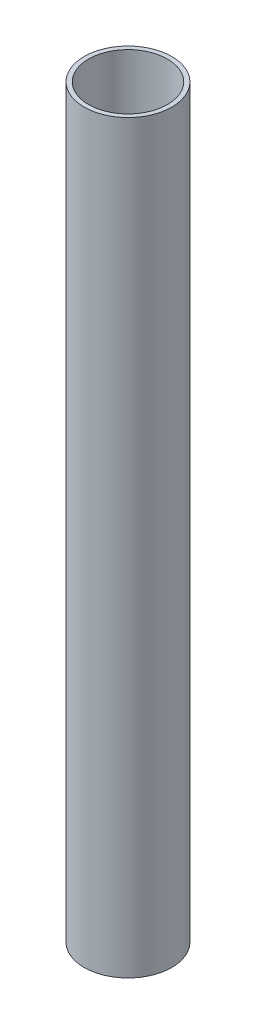
ISO-10303-21;
HEADER;
FILE_DESCRIPTION(('STEP AP214'),'2;1');
FILE_NAME('part.step','',(''),(''),'','','');
FILE_SCHEMA(('AUTOMOTIVE_DESIGN { 1 0 10303 214 1 1 1 1 }'));
ENDSEC;
DATA;
#1=APPLICATION_CONTEXT('core data for automotive mechanical design processes');
#2=APPLICATION_PROTOCOL_DEFINITION('international standard','automotive_design',2000,#1);
#3=PRODUCT_CONTEXT('',#1,'mechanical');
#4=PRODUCT('Part','Part','',(#3));
#5=PRODUCT_RELATED_PRODUCT_CATEGORY('part','',(#4));
#6=PRODUCT_DEFINITION_FORMATION('','',#4);
#7=PRODUCT_DEFINITION_CONTEXT('part definition',#1,'design');
#8=PRODUCT_DEFINITION('design','',#6,#7);
#9=PRODUCT_DEFINITION_SHAPE('','',#8);
#10=(LENGTH_UNIT() NAMED_UNIT(*) SI_UNIT(.MILLI.,.METRE.));
#11=(NAMED_UNIT(*) PLANE_ANGLE_UNIT() SI_UNIT($,.RADIAN.));
#12=(NAMED_UNIT(*) SI_UNIT($,.STERADIAN.) SOLID_ANGLE_UNIT());
#13=UNCERTAINTY_MEASURE_WITH_UNIT(LENGTH_MEASURE(1.E-05),#10,'distance_accuracy_value','');
#14=(GEOMETRIC_REPRESENTATION_CONTEXT(3) GLOBAL_UNCERTAINTY_ASSIGNED_CONTEXT((#13)) GLOBAL_UNIT_ASSIGNED_CONTEXT((#10,
#11,#12)) REPRESENTATION_CONTEXT('',''));
#15=CARTESIAN_POINT('',(0.,0.,0.));
#16=DIRECTION('',(0.,0.,1.));
#17=DIRECTION('',(1.,0.,0.));
#18=AXIS2_PLACEMENT_3D('',#15,#16,#17);
#19=CARTESIAN_POINT('',(0.,170.,0.));
#20=DIRECTION('',(0.,1.,0.));
#21=DIRECTION('',(0.,0.,1.));
#22=AXIS2_PLACEMENT_3D('',#19,#20,#21);
#23=PLANE('',#22);
#24=CARTESIAN_POINT('',(0.,170.,0.));
#25=DIRECTION('',(0.,1.,0.));
#26=DIRECTION('',(0.,0.,1.));
#27=AXIS2_PLACEMENT_3D('',#24,#25,#26);
#28=CIRCLE('',#27,10.);
#29=CARTESIAN_POINT('',(0.,170.,10.));
#30=VERTEX_POINT('',#29);
#31=EDGE_CURVE('E10',#30,#30,#28,.T.);
#32=ORIENTED_EDGE('',*,*,#31,.T.);
#33=EDGE_LOOP('',(#32));
#34=FACE_BOUND('',#33,.T.);
#35=CARTESIAN_POINT('',(0.,170.,0.));
#36=DIRECTION('',(0.,1.,0.));
#37=DIRECTION('',(0.,0.,1.));
#38=AXIS2_PLACEMENT_3D('',#35,#36,#37);
#39=CIRCLE('',#38,9.);
#40=CARTESIAN_POINT('',(0.,170.,9.));
#41=VERTEX_POINT('',#40);
#42=EDGE_CURVE('E50',#41,#41,#39,.T.);
#43=ORIENTED_EDGE('',*,*,#42,.F.);
#44=EDGE_LOOP('',(#43));
#45=FACE_BOUND('',#44,.T.);
#46=ADVANCED_FACE('F37',(#34,#45),#23,.T.);
#47=CARTESIAN_POINT('',(0.,0.,0.));
#48=DIRECTION('',(0.,1.,0.));
#49=DIRECTION('',(0.,0.,1.));
#50=AXIS2_PLACEMENT_3D('',#47,#48,#49);
#51=PLANE('',#50);
#52=CARTESIAN_POINT('',(0.,0.,0.));
#53=DIRECTION('',(0.,1.,0.));
#54=DIRECTION('',(0.,0.,1.));
#55=AXIS2_PLACEMENT_3D('',#52,#53,#54);
#56=CIRCLE('',#55,10.);
#57=CARTESIAN_POINT('',(0.,0.,10.));
#58=VERTEX_POINT('',#57);
#59=EDGE_CURVE('E41',#58,#58,#56,.T.);
#60=ORIENTED_EDGE('',*,*,#59,.F.);
#61=EDGE_LOOP('',(#60));
#62=FACE_BOUND('',#61,.T.);
#63=CARTESIAN_POINT('',(0.,0.,0.));
#64=DIRECTION('',(0.,1.,0.));
#65=DIRECTION('',(0.,0.,1.));
#66=AXIS2_PLACEMENT_3D('',#63,#64,#65);
#67=CIRCLE('',#66,9.);
#68=CARTESIAN_POINT('',(0.,0.,9.));
#69=VERTEX_POINT('',#68);
#70=EDGE_CURVE('E52',#69,#69,#67,.T.);
#71=ORIENTED_EDGE('',*,*,#70,.T.);
#72=EDGE_LOOP('',(#71));
#73=FACE_BOUND('',#72,.T.);
#74=ADVANCED_FACE('F64',(#62,#73),#51,.F.);
#75=CARTESIAN_POINT('',(0.,170.,0.));
#76=DIRECTION('',(0.,-1.,0.));
#77=DIRECTION('',(0.,0.,-1.));
#78=AXIS2_PLACEMENT_3D('',#75,#76,#77);
#79=CYLINDRICAL_SURFACE('',#78,10.);
#80=ORIENTED_EDGE('',*,*,#31,.F.);
#81=EDGE_LOOP('',(#80));
#82=FACE_BOUND('',#81,.T.);
#83=ORIENTED_EDGE('',*,*,#59,.T.);
#84=EDGE_LOOP('',(#83));
#85=FACE_BOUND('',#84,.T.);
#86=ADVANCED_FACE('F39',(#82,#85),#79,.T.);
#87=CARTESIAN_POINT('',(0.,170.,0.));
#88=DIRECTION('',(0.,-1.,0.));
#89=DIRECTION('',(0.,0.,-1.));
#90=AXIS2_PLACEMENT_3D('',#87,#88,#89);
#91=CYLINDRICAL_SURFACE('',#90,9.);
#92=ORIENTED_EDGE('',*,*,#42,.T.);
#93=EDGE_LOOP('',(#92));
#94=FACE_BOUND('',#93,.T.);
#95=ORIENTED_EDGE('',*,*,#70,.F.);
#96=EDGE_LOOP('',(#95));
#97=FACE_BOUND('',#96,.T.);
#98=ADVANCED_FACE('F60',(#94,#97),#91,.F.);
#99=CLOSED_SHELL('',(#46,#74,#86,#98));
#100=MANIFOLD_SOLID_BREP('B2',#99);
#101=ADVANCED_BREP_SHAPE_REPRESENTATION('',(#18,#100),#14);
#102=SHAPE_DEFINITION_REPRESENTATION(#9,#101);
ENDSEC;
END-ISO-10303-21;
